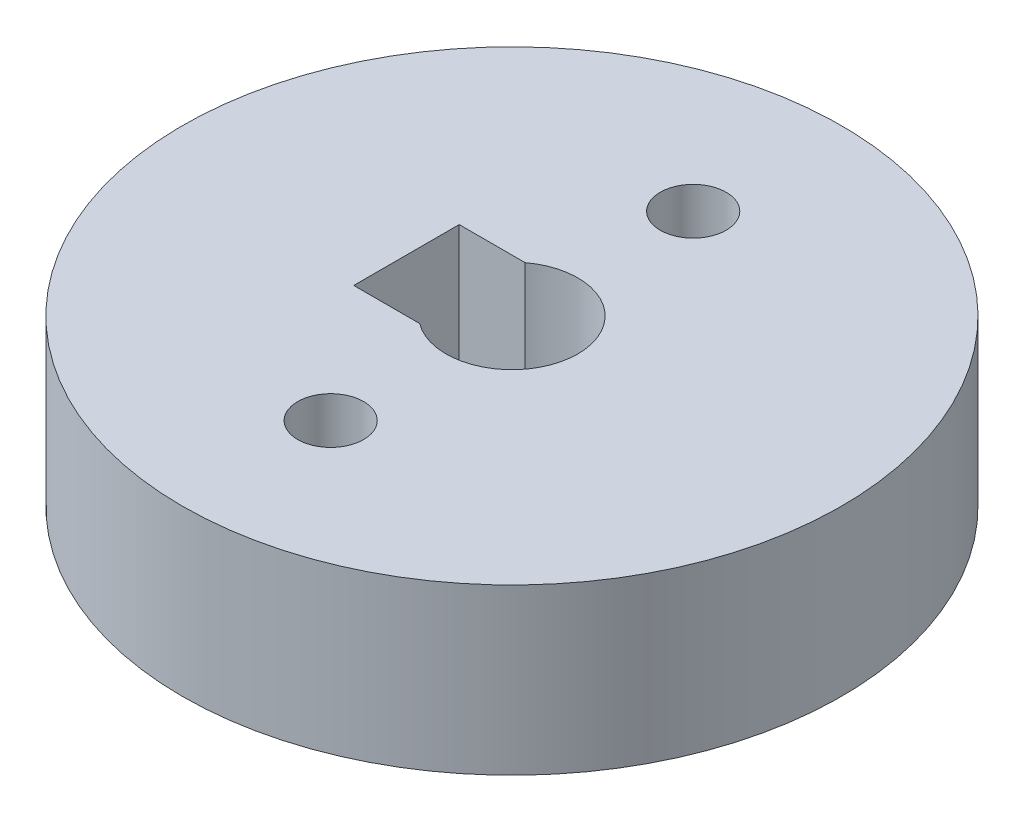
ISO-10303-21;
HEADER;
FILE_DESCRIPTION(('STEP AP214'),'2;1');
FILE_NAME('part.step','',(''),(''),'','','');
FILE_SCHEMA(('AUTOMOTIVE_DESIGN { 1 0 10303 214 1 1 1 1 }'));
ENDSEC;
DATA;
#1=APPLICATION_CONTEXT('core data for automotive mechanical design processes');
#2=APPLICATION_PROTOCOL_DEFINITION('international standard','automotive_design',2000,#1);
#3=PRODUCT_CONTEXT('',#1,'mechanical');
#4=PRODUCT('Part','Part','',(#3));
#5=PRODUCT_RELATED_PRODUCT_CATEGORY('part','',(#4));
#6=PRODUCT_DEFINITION_FORMATION('','',#4);
#7=PRODUCT_DEFINITION_CONTEXT('part definition',#1,'design');
#8=PRODUCT_DEFINITION('design','',#6,#7);
#9=PRODUCT_DEFINITION_SHAPE('','',#8);
#10=(LENGTH_UNIT() NAMED_UNIT(*) SI_UNIT(.MILLI.,.METRE.));
#11=(NAMED_UNIT(*) PLANE_ANGLE_UNIT() SI_UNIT($,.RADIAN.));
#12=(NAMED_UNIT(*) SI_UNIT($,.STERADIAN.) SOLID_ANGLE_UNIT());
#13=UNCERTAINTY_MEASURE_WITH_UNIT(LENGTH_MEASURE(1.E-05),#10,'distance_accuracy_value','');
#14=(GEOMETRIC_REPRESENTATION_CONTEXT(3) GLOBAL_UNCERTAINTY_ASSIGNED_CONTEXT((#13)) GLOBAL_UNIT_ASSIGNED_CONTEXT((#10,
#11,#12)) REPRESENTATION_CONTEXT('',''));
#15=CARTESIAN_POINT('',(0.,0.,0.));
#16=DIRECTION('',(0.,0.,1.));
#17=DIRECTION('',(1.,0.,0.));
#18=AXIS2_PLACEMENT_3D('',#15,#16,#17);
#19=CARTESIAN_POINT('',(0.,5.,0.));
#20=DIRECTION('',(0.,-1.,0.));
#21=DIRECTION('',(0.,0.,-1.));
#22=AXIS2_PLACEMENT_3D('',#19,#20,#21);
#23=CYLINDRICAL_SURFACE('',#22,2.);
#24=CARTESIAN_POINT('',(0.,0.,0.));
#25=DIRECTION('',(0.,1.,0.));
#26=DIRECTION('',(0.,0.,1.));
#27=AXIS2_PLACEMENT_3D('',#24,#25,#26);
#28=CIRCLE('',#27,2.);
#29=CARTESIAN_POINT('',(-1.2,0.,1.6));
#30=VERTEX_POINT('',#29);
#31=CARTESIAN_POINT('',(-1.2,0.,-1.6));
#32=VERTEX_POINT('',#31);
#33=EDGE_CURVE('E99',#30,#32,#28,.T.);
#34=ORIENTED_EDGE('',*,*,#33,.F.);
#35=DIRECTION('',(0.,-1.,0.));
#36=VECTOR('',#35,1.);
#37=CARTESIAN_POINT('',(-1.2,5.,1.6));
#38=LINE('',#37,#36);
#39=CARTESIAN_POINT('',(-1.2,5.,1.6));
#40=VERTEX_POINT('',#39);
#41=EDGE_CURVE('E11',#40,#30,#38,.T.);
#42=ORIENTED_EDGE('',*,*,#41,.F.);
#43=CARTESIAN_POINT('',(0.,5.,0.));
#44=DIRECTION('',(0.,1.,0.));
#45=DIRECTION('',(0.,0.,1.));
#46=AXIS2_PLACEMENT_3D('',#43,#44,#45);
#47=CIRCLE('',#46,2.);
#48=CARTESIAN_POINT('',(-1.2,5.,-1.6));
#49=VERTEX_POINT('',#48);
#50=EDGE_CURVE('E84',#40,#49,#47,.T.);
#51=ORIENTED_EDGE('',*,*,#50,.T.);
#52=DIRECTION('',(0.,-1.,0.));
#53=VECTOR('',#52,1.);
#54=CARTESIAN_POINT('',(-1.2,5.,-1.6));
#55=LINE('',#54,#53);
#56=EDGE_CURVE('E72',#49,#32,#55,.T.);
#57=ORIENTED_EDGE('',*,*,#56,.T.);
#58=EDGE_LOOP('',(#34,#42,#51,#57));
#59=FACE_BOUND('',#58,.T.);
#60=ADVANCED_FACE('F33',(#59),#23,.F.);
#61=CARTESIAN_POINT('',(0.,5.,1.6));
#62=DIRECTION('',(0.,0.,1.));
#63=DIRECTION('',(1.,0.,0.));
#64=AXIS2_PLACEMENT_3D('',#61,#62,#63);
#65=PLANE('',#64);
#66=DIRECTION('',(-1.,0.,0.));
#67=VECTOR('',#66,1.);
#68=CARTESIAN_POINT('',(0.,0.,1.6));
#69=LINE('',#68,#67);
#70=CARTESIAN_POINT('',(-3.2,0.,1.6));
#71=VERTEX_POINT('',#70);
#72=EDGE_CURVE('E89',#30,#71,#69,.T.);
#73=ORIENTED_EDGE('',*,*,#72,.T.);
#74=DIRECTION('',(0.,-1.,0.));
#75=VECTOR('',#74,1.);
#76=CARTESIAN_POINT('',(-3.2,5.,1.6));
#77=LINE('',#76,#75);
#78=CARTESIAN_POINT('',(-3.2,5.,1.6));
#79=VERTEX_POINT('',#78);
#80=EDGE_CURVE('E41',#79,#71,#77,.T.);
#81=ORIENTED_EDGE('',*,*,#80,.F.);
#82=DIRECTION('',(-1.,0.,0.));
#83=VECTOR('',#82,1.);
#84=CARTESIAN_POINT('',(0.,5.,1.6));
#85=LINE('',#84,#83);
#86=EDGE_CURVE('E78',#40,#79,#85,.T.);
#87=ORIENTED_EDGE('',*,*,#86,.F.);
#88=ORIENTED_EDGE('',*,*,#41,.T.);
#89=EDGE_LOOP('',(#73,#81,#87,#88));
#90=FACE_BOUND('',#89,.T.);
#91=ADVANCED_FACE('F87',(#90),#65,.F.);
#92=CARTESIAN_POINT('',(-3.2,5.,0.));
#93=DIRECTION('',(-1.,0.,0.));
#94=DIRECTION('',(0.,0.,1.));
#95=AXIS2_PLACEMENT_3D('',#92,#93,#94);
#96=PLANE('',#95);
#97=DIRECTION('',(0.,0.,-1.));
#98=VECTOR('',#97,1.);
#99=CARTESIAN_POINT('',(-3.2,0.,0.));
#100=LINE('',#99,#98);
#101=CARTESIAN_POINT('',(-3.2,0.,-1.6));
#102=VERTEX_POINT('',#101);
#103=EDGE_CURVE('E65',#71,#102,#100,.T.);
#104=ORIENTED_EDGE('',*,*,#103,.T.);
#105=DIRECTION('',(0.,-1.,0.));
#106=VECTOR('',#105,1.);
#107=CARTESIAN_POINT('',(-3.2,5.,-1.6));
#108=LINE('',#107,#106);
#109=CARTESIAN_POINT('',(-3.2,5.,-1.6));
#110=VERTEX_POINT('',#109);
#111=EDGE_CURVE('E90',#110,#102,#108,.T.);
#112=ORIENTED_EDGE('',*,*,#111,.F.);
#113=DIRECTION('',(0.,0.,-1.));
#114=VECTOR('',#113,1.);
#115=CARTESIAN_POINT('',(-3.2,5.,0.));
#116=LINE('',#115,#114);
#117=EDGE_CURVE('E83',#79,#110,#116,.T.);
#118=ORIENTED_EDGE('',*,*,#117,.F.);
#119=ORIENTED_EDGE('',*,*,#80,.T.);
#120=EDGE_LOOP('',(#104,#112,#118,#119));
#121=FACE_BOUND('',#120,.T.);
#122=ADVANCED_FACE('F91',(#121),#96,.F.);
#123=CARTESIAN_POINT('',(0.,5.,-1.6));
#124=DIRECTION('',(0.,0.,-1.));
#125=DIRECTION('',(-1.,0.,0.));
#126=AXIS2_PLACEMENT_3D('',#123,#124,#125);
#127=PLANE('',#126);
#128=DIRECTION('',(1.,0.,0.));
#129=VECTOR('',#128,1.);
#130=CARTESIAN_POINT('',(0.,0.,-1.6));
#131=LINE('',#130,#129);
#132=EDGE_CURVE('E105',#102,#32,#131,.T.);
#133=ORIENTED_EDGE('',*,*,#132,.T.);
#134=ORIENTED_EDGE('',*,*,#56,.F.);
#135=DIRECTION('',(1.,0.,0.));
#136=VECTOR('',#135,1.);
#137=CARTESIAN_POINT('',(0.,5.,-1.6));
#138=LINE('',#137,#136);
#139=EDGE_CURVE('E49',#110,#49,#138,.T.);
#140=ORIENTED_EDGE('',*,*,#139,.F.);
#141=ORIENTED_EDGE('',*,*,#111,.T.);
#142=EDGE_LOOP('',(#133,#134,#140,#141));
#143=FACE_BOUND('',#142,.T.);
#144=ADVANCED_FACE('F113',(#143),#127,.F.);
#145=CARTESIAN_POINT('',(0.,5.,0.));
#146=DIRECTION('',(0.,-1.,0.));
#147=DIRECTION('',(0.,0.,-1.));
#148=AXIS2_PLACEMENT_3D('',#145,#146,#147);
#149=CYLINDRICAL_SURFACE('',#148,10.);
#150=CARTESIAN_POINT('',(0.,5.,0.));
#151=DIRECTION('',(0.,1.,0.));
#152=DIRECTION('',(0.,0.,1.));
#153=AXIS2_PLACEMENT_3D('',#150,#151,#152);
#154=CIRCLE('',#153,10.);
#155=CARTESIAN_POINT('',(0.,5.,10.));
#156=VERTEX_POINT('',#155);
#157=EDGE_CURVE('E93',#156,#156,#154,.T.);
#158=ORIENTED_EDGE('',*,*,#157,.F.);
#159=EDGE_LOOP('',(#158));
#160=FACE_BOUND('',#159,.T.);
#161=CARTESIAN_POINT('',(0.,0.,0.));
#162=DIRECTION('',(0.,1.,0.));
#163=DIRECTION('',(0.,0.,1.));
#164=AXIS2_PLACEMENT_3D('',#161,#162,#163);
#165=CIRCLE('',#164,10.);
#166=CARTESIAN_POINT('',(0.,0.,10.));
#167=VERTEX_POINT('',#166);
#168=EDGE_CURVE('E107',#167,#167,#165,.T.);
#169=ORIENTED_EDGE('',*,*,#168,.T.);
#170=EDGE_LOOP('',(#169));
#171=FACE_BOUND('',#170,.T.);
#172=ADVANCED_FACE('F128',(#160,#171),#149,.T.);
#173=CARTESIAN_POINT('',(0.,5.,0.));
#174=DIRECTION('',(0.,1.,0.));
#175=DIRECTION('',(0.,0.,1.));
#176=AXIS2_PLACEMENT_3D('',#173,#174,#175);
#177=PLANE('',#176);
#178=CARTESIAN_POINT('',(0.,5.,5.5));
#179=DIRECTION('',(0.,1.,0.));
#180=DIRECTION('',(0.,0.,1.));
#181=AXIS2_PLACEMENT_3D('',#178,#179,#180);
#182=CIRCLE('',#181,1.00000000000001);
#183=CARTESIAN_POINT('',(0.,5.,6.50000000000001));
#184=VERTEX_POINT('',#183);
#185=EDGE_CURVE('E153',#184,#184,#182,.T.);
#186=ORIENTED_EDGE('',*,*,#185,.F.);
#187=EDGE_LOOP('',(#186));
#188=FACE_BOUND('',#187,.T.);
#189=CARTESIAN_POINT('',(0.,5.,-5.5));
#190=DIRECTION('',(0.,1.,0.));
#191=DIRECTION('',(0.,0.,1.));
#192=AXIS2_PLACEMENT_3D('',#189,#190,#191);
#193=CIRCLE('',#192,1.00000000000001);
#194=CARTESIAN_POINT('',(0.,5.,-4.49999999999999));
#195=VERTEX_POINT('',#194);
#196=EDGE_CURVE('E155',#195,#195,#193,.T.);
#197=ORIENTED_EDGE('',*,*,#196,.F.);
#198=EDGE_LOOP('',(#197));
#199=FACE_BOUND('',#198,.T.);
#200=ORIENTED_EDGE('',*,*,#50,.F.);
#201=ORIENTED_EDGE('',*,*,#86,.T.);
#202=ORIENTED_EDGE('',*,*,#117,.T.);
#203=ORIENTED_EDGE('',*,*,#139,.T.);
#204=EDGE_LOOP('',(#200,#201,#202,#203));
#205=FACE_BOUND('',#204,.T.);
#206=ORIENTED_EDGE('',*,*,#157,.T.);
#207=EDGE_LOOP('',(#206));
#208=FACE_BOUND('',#207,.T.);
#209=ADVANCED_FACE('F80',(#188,#199,#205,#208),#177,.T.);
#210=CARTESIAN_POINT('',(0.,0.,0.));
#211=DIRECTION('',(0.,1.,0.));
#212=DIRECTION('',(0.,0.,1.));
#213=AXIS2_PLACEMENT_3D('',#210,#211,#212);
#214=PLANE('',#213);
#215=CARTESIAN_POINT('',(0.,0.,5.5));
#216=DIRECTION('',(0.,1.,0.));
#217=DIRECTION('',(0.,0.,1.));
#218=AXIS2_PLACEMENT_3D('',#215,#216,#217);
#219=CIRCLE('',#218,1.00000000000001);
#220=CARTESIAN_POINT('',(0.,0.,6.50000000000001));
#221=VERTEX_POINT('',#220);
#222=EDGE_CURVE('E150',#221,#221,#219,.T.);
#223=ORIENTED_EDGE('',*,*,#222,.T.);
#224=EDGE_LOOP('',(#223));
#225=FACE_BOUND('',#224,.T.);
#226=CARTESIAN_POINT('',(0.,0.,-5.5));
#227=DIRECTION('',(0.,1.,0.));
#228=DIRECTION('',(0.,0.,1.));
#229=AXIS2_PLACEMENT_3D('',#226,#227,#228);
#230=CIRCLE('',#229,1.00000000000001);
#231=CARTESIAN_POINT('',(0.,0.,-4.49999999999999));
#232=VERTEX_POINT('',#231);
#233=EDGE_CURVE('E102',#232,#232,#230,.T.);
#234=ORIENTED_EDGE('',*,*,#233,.T.);
#235=EDGE_LOOP('',(#234));
#236=FACE_BOUND('',#235,.T.);
#237=ORIENTED_EDGE('',*,*,#33,.T.);
#238=ORIENTED_EDGE('',*,*,#132,.F.);
#239=ORIENTED_EDGE('',*,*,#103,.F.);
#240=ORIENTED_EDGE('',*,*,#72,.F.);
#241=EDGE_LOOP('',(#237,#238,#239,#240));
#242=FACE_BOUND('',#241,.T.);
#243=ORIENTED_EDGE('',*,*,#168,.F.);
#244=EDGE_LOOP('',(#243));
#245=FACE_BOUND('',#244,.T.);
#246=ADVANCED_FACE('F115',(#225,#236,#242,#245),#214,.F.);
#247=CARTESIAN_POINT('',(0.,5.,-5.5));
#248=DIRECTION('',(0.,1.,0.));
#249=DIRECTION('',(0.,0.,1.));
#250=AXIS2_PLACEMENT_3D('',#247,#248,#249);
#251=CYLINDRICAL_SURFACE('',#250,1.00000000000001);
#252=ORIENTED_EDGE('',*,*,#233,.F.);
#253=EDGE_LOOP('',(#252));
#254=FACE_BOUND('',#253,.T.);
#255=ORIENTED_EDGE('',*,*,#196,.T.);
#256=EDGE_LOOP('',(#255));
#257=FACE_BOUND('',#256,.T.);
#258=ADVANCED_FACE('F134',(#254,#257),#251,.F.);
#259=CARTESIAN_POINT('',(0.,5.,5.5));
#260=DIRECTION('',(0.,1.,0.));
#261=DIRECTION('',(0.,0.,1.));
#262=AXIS2_PLACEMENT_3D('',#259,#260,#261);
#263=CYLINDRICAL_SURFACE('',#262,1.00000000000001);
#264=ORIENTED_EDGE('',*,*,#222,.F.);
#265=EDGE_LOOP('',(#264));
#266=FACE_BOUND('',#265,.T.);
#267=ORIENTED_EDGE('',*,*,#185,.T.);
#268=EDGE_LOOP('',(#267));
#269=FACE_BOUND('',#268,.T.);
#270=ADVANCED_FACE('F141',(#266,#269),#263,.F.);
#271=CLOSED_SHELL('',(#60,#91,#122,#144,#172,#209,#246,#258,#270));
#272=MANIFOLD_SOLID_BREP('B2',#271);
#273=ADVANCED_BREP_SHAPE_REPRESENTATION('',(#18,#272),#14);
#274=SHAPE_DEFINITION_REPRESENTATION(#9,#273);
ENDSEC;
END-ISO-10303-21;
